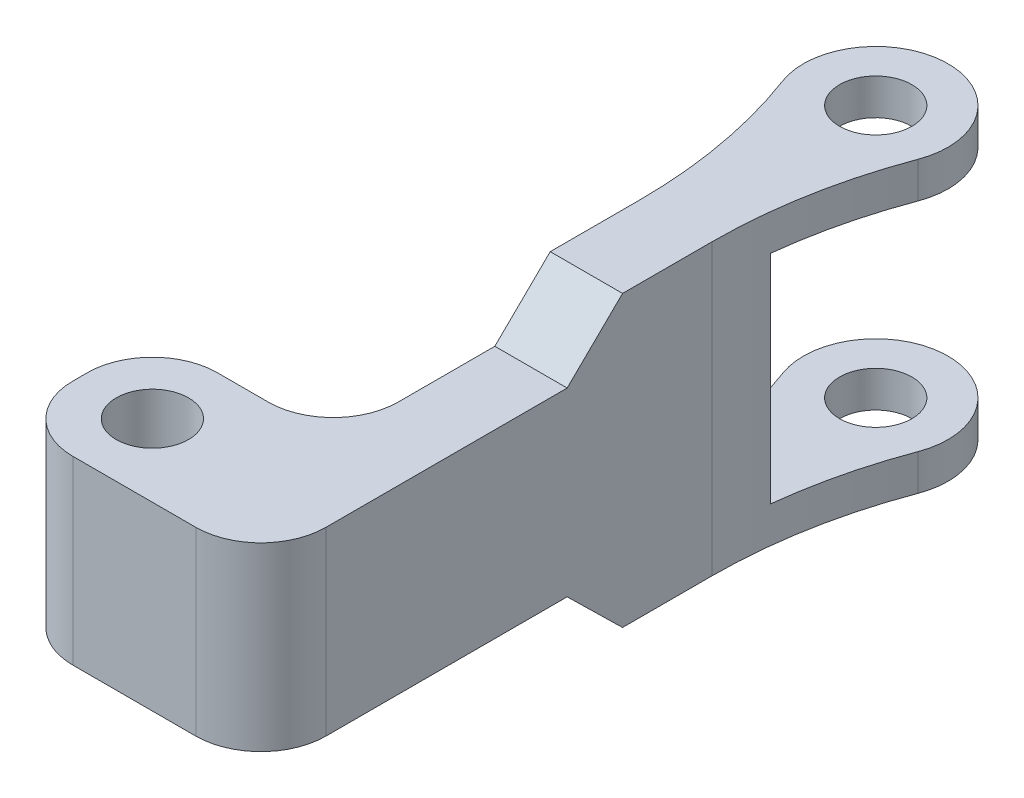
ISO-10303-21;
HEADER;
FILE_DESCRIPTION(('STEP AP214'),'2;1');
FILE_NAME('part.step','',(''),(''),'','','');
FILE_SCHEMA(('AUTOMOTIVE_DESIGN { 1 0 10303 214 1 1 1 1 }'));
ENDSEC;
DATA;
#1=APPLICATION_CONTEXT('core data for automotive mechanical design processes');
#2=APPLICATION_PROTOCOL_DEFINITION('international standard','automotive_design',2000,#1);
#3=PRODUCT_CONTEXT('',#1,'mechanical');
#4=PRODUCT('Part','Part','',(#3));
#5=PRODUCT_RELATED_PRODUCT_CATEGORY('part','',(#4));
#6=PRODUCT_DEFINITION_FORMATION('','',#4);
#7=PRODUCT_DEFINITION_CONTEXT('part definition',#1,'design');
#8=PRODUCT_DEFINITION('design','',#6,#7);
#9=PRODUCT_DEFINITION_SHAPE('','',#8);
#10=(LENGTH_UNIT() NAMED_UNIT(*) SI_UNIT(.MILLI.,.METRE.));
#11=(NAMED_UNIT(*) PLANE_ANGLE_UNIT() SI_UNIT($,.RADIAN.));
#12=(NAMED_UNIT(*) SI_UNIT($,.STERADIAN.) SOLID_ANGLE_UNIT());
#13=UNCERTAINTY_MEASURE_WITH_UNIT(LENGTH_MEASURE(1.E-05),#10,'distance_accuracy_value','');
#14=(GEOMETRIC_REPRESENTATION_CONTEXT(3) GLOBAL_UNCERTAINTY_ASSIGNED_CONTEXT((#13)) GLOBAL_UNIT_ASSIGNED_CONTEXT((#10,
#11,#12)) REPRESENTATION_CONTEXT('',''));
#15=CARTESIAN_POINT('',(0.,0.,0.));
#16=DIRECTION('',(0.,0.,1.));
#17=DIRECTION('',(1.,0.,0.));
#18=AXIS2_PLACEMENT_3D('',#15,#16,#17);
#19=CARTESIAN_POINT('',(10.,25.,-40.));
#20=DIRECTION('',(0.,-1.,0.));
#21=DIRECTION('',(0.,0.,-1.));
#22=AXIS2_PLACEMENT_3D('',#19,#20,#21);
#23=CYLINDRICAL_SURFACE('',#22,2.50000000000001);
#24=CARTESIAN_POINT('',(10.,5.,-40.));
#25=DIRECTION('',(0.,1.,0.));
#26=DIRECTION('',(0.,0.,1.));
#27=AXIS2_PLACEMENT_3D('',#24,#25,#26);
#28=CIRCLE('',#27,2.50000000000001);
#29=CARTESIAN_POINT('',(10.,5.,-37.5));
#30=VERTEX_POINT('',#29);
#31=EDGE_CURVE('E306',#30,#30,#28,.T.);
#32=ORIENTED_EDGE('',*,*,#31,.T.);
#33=EDGE_LOOP('',(#32));
#34=FACE_BOUND('',#33,.T.);
#35=CARTESIAN_POINT('',(10.,2.5,-40.));
#36=DIRECTION('',(0.,-1.,0.));
#37=DIRECTION('',(0.,0.,-1.));
#38=AXIS2_PLACEMENT_3D('',#35,#36,#37);
#39=CIRCLE('',#38,2.50000000000001);
#40=CARTESIAN_POINT('',(10.,2.49999999999999,-42.5));
#41=VERTEX_POINT('',#40);
#42=EDGE_CURVE('E215',#41,#41,#39,.T.);
#43=ORIENTED_EDGE('',*,*,#42,.T.);
#44=EDGE_LOOP('',(#43));
#45=FACE_BOUND('',#44,.T.);
#46=ADVANCED_FACE('F40',(#34,#45),#23,.F.);
#47=CARTESIAN_POINT('',(15.,5.,-30.0010376150604));
#48=DIRECTION('',(0.,0.,-1.));
#49=DIRECTION('',(0.,1.,0.));
#50=AXIS2_PLACEMENT_3D('',#47,#48,#49);
#51=PLANE('',#50);
#52=DIRECTION('',(0.,-1.,0.));
#53=VECTOR('',#52,1.);
#54=CARTESIAN_POINT('',(12.7132914100987,25.,-30.0010376150604));
#55=LINE('',#54,#53);
#56=CARTESIAN_POINT('',(12.7132914100987,20.,-30.0010376150604));
#57=VERTEX_POINT('',#56);
#58=CARTESIAN_POINT('',(12.7132914100987,5.,-30.0010376150604));
#59=VERTEX_POINT('',#58);
#60=EDGE_CURVE('E177',#57,#59,#55,.T.);
#61=ORIENTED_EDGE('',*,*,#60,.T.);
#62=DIRECTION('',(-1.,0.,0.));
#63=VECTOR('',#62,1.);
#64=CARTESIAN_POINT('',(15.,5.,-30.0010376150604));
#65=LINE('',#64,#63);
#66=CARTESIAN_POINT('',(7.28670858990132,5.,-30.0010376150604));
#67=VERTEX_POINT('',#66);
#68=EDGE_CURVE('E180',#59,#67,#65,.T.);
#69=ORIENTED_EDGE('',*,*,#68,.T.);
#70=DIRECTION('',(0.,-1.,0.));
#71=VECTOR('',#70,1.);
#72=CARTESIAN_POINT('',(7.28670858990132,25.,-30.0010376150604));
#73=LINE('',#72,#71);
#74=CARTESIAN_POINT('',(7.28670858990132,20.,-30.0010376150604));
#75=VERTEX_POINT('',#74);
#76=EDGE_CURVE('E11',#67,#75,#73,.F.);
#77=ORIENTED_EDGE('',*,*,#76,.T.);
#78=DIRECTION('',(-1.,0.,0.));
#79=VECTOR('',#78,1.);
#80=CARTESIAN_POINT('',(15.,20.,-30.0010376150604));
#81=LINE('',#80,#79);
#82=EDGE_CURVE('E183',#57,#75,#81,.T.);
#83=ORIENTED_EDGE('',*,*,#82,.F.);
#84=EDGE_LOOP('',(#61,#69,#77,#83));
#85=FACE_BOUND('',#84,.T.);
#86=ADVANCED_FACE('F179',(#85),#51,.T.);
#87=CARTESIAN_POINT('',(15.,20.,-30.0010376150604));
#88=DIRECTION('',(0.,-1.,0.));
#89=DIRECTION('',(0.,0.,-1.));
#90=AXIS2_PLACEMENT_3D('',#87,#88,#89);
#91=PLANE('',#90);
#92=CARTESIAN_POINT('',(10.,20.,-40.));
#93=DIRECTION('',(0.,-1.,0.));
#94=DIRECTION('',(0.,0.,-1.));
#95=AXIS2_PLACEMENT_3D('',#92,#93,#94);
#96=CIRCLE('',#95,2.50000000000001);
#97=CARTESIAN_POINT('',(10.,20.,-42.5));
#98=VERTEX_POINT('',#97);
#99=EDGE_CURVE('E201',#98,#98,#96,.T.);
#100=ORIENTED_EDGE('',*,*,#99,.F.);
#101=EDGE_LOOP('',(#100));
#102=FACE_BOUND('',#101,.T.);
#103=CARTESIAN_POINT('',(47.,20.,-26.1706833140606));
#104=DIRECTION('',(0.,-1.,0.));
#105=DIRECTION('',(0.,0.,-1.));
#106=AXIS2_PLACEMENT_3D('',#103,#104,#105);
#107=CIRCLE('',#106,34.5);
#108=CARTESIAN_POINT('',(14.6835443037975,20.,-38.2494535840583));
#109=VERTEX_POINT('',#108);
#110=EDGE_CURVE('E213',#109,#57,#107,.F.);
#111=ORIENTED_EDGE('',*,*,#110,.T.);
#112=ORIENTED_EDGE('',*,*,#82,.T.);
#113=CARTESIAN_POINT('',(-27.,20.,-26.1706833140606));
#114=DIRECTION('',(0.,-1.,0.));
#115=DIRECTION('',(0.,0.,-1.));
#116=AXIS2_PLACEMENT_3D('',#113,#114,#115);
#117=CIRCLE('',#116,34.5);
#118=CARTESIAN_POINT('',(5.31645569620252,20.,-38.2494535840583));
#119=VERTEX_POINT('',#118);
#120=EDGE_CURVE('E204',#75,#119,#117,.F.);
#121=ORIENTED_EDGE('',*,*,#120,.T.);
#122=CARTESIAN_POINT('',(10.,20.,-40.));
#123=DIRECTION('',(0.,-1.,0.));
#124=DIRECTION('',(0.,0.,-1.));
#125=AXIS2_PLACEMENT_3D('',#122,#123,#124);
#126=CIRCLE('',#125,5.00000000000001);
#127=EDGE_CURVE('E211',#119,#109,#126,.T.);
#128=ORIENTED_EDGE('',*,*,#127,.T.);
#129=EDGE_LOOP('',(#111,#112,#121,#128));
#130=FACE_BOUND('',#129,.T.);
#131=ADVANCED_FACE('F367',(#102,#130),#91,.T.);
#132=CARTESIAN_POINT('',(15.,5.00000000000001,-45.0010376150604));
#133=DIRECTION('',(0.,1.,0.));
#134=DIRECTION('',(0.,0.,1.));
#135=AXIS2_PLACEMENT_3D('',#132,#133,#134);
#136=PLANE('',#135);
#137=ORIENTED_EDGE('',*,*,#31,.F.);
#138=EDGE_LOOP('',(#137));
#139=FACE_BOUND('',#138,.T.);
#140=CARTESIAN_POINT('',(47.,5.,-26.1706833140606));
#141=DIRECTION('',(0.,1.,0.));
#142=DIRECTION('',(0.,0.,1.));
#143=AXIS2_PLACEMENT_3D('',#140,#141,#142);
#144=CIRCLE('',#143,34.5);
#145=CARTESIAN_POINT('',(14.6835443037975,5.,-38.2494535840583));
#146=VERTEX_POINT('',#145);
#147=EDGE_CURVE('E191',#59,#146,#144,.F.);
#148=ORIENTED_EDGE('',*,*,#147,.T.);
#149=CARTESIAN_POINT('',(10.,5.,-40.));
#150=DIRECTION('',(0.,1.,0.));
#151=DIRECTION('',(0.,0.,1.));
#152=AXIS2_PLACEMENT_3D('',#149,#150,#151);
#153=CIRCLE('',#152,5.00000000000001);
#154=CARTESIAN_POINT('',(5.31645569620252,5.,-38.2494535840583));
#155=VERTEX_POINT('',#154);
#156=EDGE_CURVE('E55',#146,#155,#153,.T.);
#157=ORIENTED_EDGE('',*,*,#156,.T.);
#158=CARTESIAN_POINT('',(-27.,5.,-26.1706833140606));
#159=DIRECTION('',(0.,1.,0.));
#160=DIRECTION('',(0.,0.,1.));
#161=AXIS2_PLACEMENT_3D('',#158,#159,#160);
#162=CIRCLE('',#161,34.5);
#163=EDGE_CURVE('E192',#155,#67,#162,.F.);
#164=ORIENTED_EDGE('',*,*,#163,.T.);
#165=ORIENTED_EDGE('',*,*,#68,.F.);
#166=EDGE_LOOP('',(#148,#157,#164,#165));
#167=FACE_BOUND('',#166,.T.);
#168=ADVANCED_FACE('F190',(#139,#167),#136,.T.);
#169=ORIENTED_EDGE('',*,*,#99,.T.);
#170=EDGE_LOOP('',(#169));
#171=FACE_BOUND('',#170,.T.);
#172=CARTESIAN_POINT('',(10.,22.5,-40.));
#173=DIRECTION('',(0.,1.,0.));
#174=DIRECTION('',(0.,0.,1.));
#175=AXIS2_PLACEMENT_3D('',#172,#173,#174);
#176=CIRCLE('',#175,2.50000000000001);
#177=CARTESIAN_POINT('',(10.,22.5,-37.5));
#178=VERTEX_POINT('',#177);
#179=EDGE_CURVE('E227',#178,#178,#176,.T.);
#180=ORIENTED_EDGE('',*,*,#179,.T.);
#181=EDGE_LOOP('',(#180));
#182=FACE_BOUND('',#181,.T.);
#183=ADVANCED_FACE('F410',(#171,#182),#23,.F.);
#184=CARTESIAN_POINT('',(15.,6.25,-16.1706833140606));
#185=DIRECTION('',(0.,-0.714467452155446,0.699668678597596));
#186=DIRECTION('',(0.,-0.699668678597596,-0.714467452155446));
#187=AXIS2_PLACEMENT_3D('',#184,#185,#186);
#188=PLANE('',#187);
#189=DIRECTION('',(0.,0.699668678597596,0.714467452155446));
#190=VECTOR('',#189,1.);
#191=CARTESIAN_POINT('',(12.5,16.0140183364893,-6.20014509066422));
#192=LINE('',#191,#190);
#193=CARTESIAN_POINT('',(12.5,2.5,-20.));
#194=VERTEX_POINT('',#193);
#195=CARTESIAN_POINT('',(12.5,6.25,-16.1706833140606));
#196=VERTEX_POINT('',#195);
#197=EDGE_CURVE('E267',#194,#196,#192,.T.);
#198=ORIENTED_EDGE('',*,*,#197,.T.);
#199=DIRECTION('',(-1.,0.,0.));
#200=VECTOR('',#199,1.);
#201=CARTESIAN_POINT('',(15.,6.25,-16.1706833140606));
#202=LINE('',#201,#200);
#203=CARTESIAN_POINT('',(7.5,6.25,-16.1706833140606));
#204=VERTEX_POINT('',#203);
#205=EDGE_CURVE('E361',#196,#204,#202,.T.);
#206=ORIENTED_EDGE('',*,*,#205,.T.);
#207=DIRECTION('',(0.,-0.699668678597596,-0.714467452155446));
#208=VECTOR('',#207,1.);
#209=CARTESIAN_POINT('',(7.5,18.7634160763176,-3.392594519622));
#210=LINE('',#209,#208);
#211=CARTESIAN_POINT('',(7.5,2.5,-20.));
#212=VERTEX_POINT('',#211);
#213=EDGE_CURVE('E305',#204,#212,#210,.T.);
#214=ORIENTED_EDGE('',*,*,#213,.T.);
#215=DIRECTION('',(-1.,0.,0.));
#216=VECTOR('',#215,1.);
#217=CARTESIAN_POINT('',(15.,2.5,-20.));
#218=LINE('',#217,#216);
#219=EDGE_CURVE('E358',#194,#212,#218,.T.);
#220=ORIENTED_EDGE('',*,*,#219,.F.);
#221=EDGE_LOOP('',(#198,#206,#214,#220));
#222=FACE_BOUND('',#221,.T.);
#223=ADVANCED_FACE('F392',(#222),#188,.T.);
#224=CARTESIAN_POINT('',(15.,6.25,5.));
#225=DIRECTION('',(0.,-1.,0.));
#226=DIRECTION('',(0.,0.,-1.));
#227=AXIS2_PLACEMENT_3D('',#224,#225,#226);
#228=PLANE('',#227);
#229=CARTESIAN_POINT('',(0.,6.25,0.));
#230=DIRECTION('',(0.,-1.,0.));
#231=DIRECTION('',(0.,0.,-1.));
#232=AXIS2_PLACEMENT_3D('',#229,#230,#231);
#233=CIRCLE('',#232,2.5);
#234=CARTESIAN_POINT('',(0.,6.25,-2.5));
#235=VERTEX_POINT('',#234);
#236=EDGE_CURVE('E238',#235,#235,#233,.T.);
#237=ORIENTED_EDGE('',*,*,#236,.F.);
#238=EDGE_LOOP('',(#237));
#239=FACE_BOUND('',#238,.T.);
#240=CARTESIAN_POINT('',(-0.5,6.25,0.5));
#241=DIRECTION('',(0.,-1.,0.));
#242=DIRECTION('',(0.,0.,-1.));
#243=AXIS2_PLACEMENT_3D('',#240,#241,#242);
#244=CIRCLE('',#243,4.5);
#245=CARTESIAN_POINT('',(-0.499999999999967,6.25,5.));
#246=VERTEX_POINT('',#245);
#247=CARTESIAN_POINT('',(-5.,6.25,0.499999999999967));
#248=VERTEX_POINT('',#247);
#249=EDGE_CURVE('E251',#246,#248,#244,.T.);
#250=ORIENTED_EDGE('',*,*,#249,.T.);
#251=DIRECTION('',(0.,0.,1.));
#252=VECTOR('',#251,1.);
#253=CARTESIAN_POINT('',(-5.,6.25,5.));
#254=LINE('',#253,#252);
#255=CARTESIAN_POINT('',(-5.,6.25,-0.500000000000001));
#256=VERTEX_POINT('',#255);
#257=EDGE_CURVE('E193',#256,#248,#254,.T.);
#258=ORIENTED_EDGE('',*,*,#257,.F.);
#259=CARTESIAN_POINT('',(-0.499999999999936,6.25,-0.5));
#260=DIRECTION('',(0.,-1.,0.));
#261=DIRECTION('',(0.,0.,-1.));
#262=AXIS2_PLACEMENT_3D('',#259,#260,#261);
#263=CIRCLE('',#262,4.5);
#264=CARTESIAN_POINT('',(-0.499999999999936,6.25,-5.));
#265=VERTEX_POINT('',#264);
#266=EDGE_CURVE('E239',#256,#265,#263,.T.);
#267=ORIENTED_EDGE('',*,*,#266,.T.);
#268=DIRECTION('',(1.,0.,0.));
#269=VECTOR('',#268,1.);
#270=CARTESIAN_POINT('',(-0.499999999999936,6.25,-5.));
#271=LINE('',#270,#269);
#272=CARTESIAN_POINT('',(3.,6.25,-5.));
#273=VERTEX_POINT('',#272);
#274=EDGE_CURVE('E241',#265,#273,#271,.T.);
#275=ORIENTED_EDGE('',*,*,#274,.T.);
#276=CARTESIAN_POINT('',(3.,6.25,-9.5));
#277=DIRECTION('',(0.,-1.,0.));
#278=DIRECTION('',(0.,0.,-1.));
#279=AXIS2_PLACEMENT_3D('',#276,#277,#278);
#280=CIRCLE('',#279,4.5);
#281=CARTESIAN_POINT('',(7.5,6.25,-9.5));
#282=VERTEX_POINT('',#281);
#283=EDGE_CURVE('E243',#273,#282,#280,.F.);
#284=ORIENTED_EDGE('',*,*,#283,.T.);
#285=DIRECTION('',(0.,0.,-1.));
#286=VECTOR('',#285,1.);
#287=CARTESIAN_POINT('',(7.5,6.25,-9.5));
#288=LINE('',#287,#286);
#289=EDGE_CURVE('E245',#282,#204,#288,.T.);
#290=ORIENTED_EDGE('',*,*,#289,.T.);
#291=ORIENTED_EDGE('',*,*,#205,.F.);
#292=DIRECTION('',(0.,0.,1.));
#293=VECTOR('',#292,1.);
#294=CARTESIAN_POINT('',(12.5,6.25,-15.));
#295=LINE('',#294,#293);
#296=CARTESIAN_POINT('',(12.5,6.25,0.499999999999967));
#297=VERTEX_POINT('',#296);
#298=EDGE_CURVE('E247',#196,#297,#295,.T.);
#299=ORIENTED_EDGE('',*,*,#298,.T.);
#300=CARTESIAN_POINT('',(8.,6.25,0.5));
#301=DIRECTION('',(0.,-1.,0.));
#302=DIRECTION('',(0.,0.,-1.));
#303=AXIS2_PLACEMENT_3D('',#300,#301,#302);
#304=CIRCLE('',#303,4.5);
#305=CARTESIAN_POINT('',(8.,6.25,5.));
#306=VERTEX_POINT('',#305);
#307=EDGE_CURVE('E249',#297,#306,#304,.T.);
#308=ORIENTED_EDGE('',*,*,#307,.T.);
#309=DIRECTION('',(-1.,0.,0.));
#310=VECTOR('',#309,1.);
#311=CARTESIAN_POINT('',(15.,6.25,5.));
#312=LINE('',#311,#310);
#313=EDGE_CURVE('E677',#306,#246,#312,.T.);
#314=ORIENTED_EDGE('',*,*,#313,.T.);
#315=EDGE_LOOP('',(#250,#258,#267,#275,#284,#290,#291,#299,#308,#314));
#316=FACE_BOUND('',#315,.T.);
#317=ADVANCED_FACE('F424',(#239,#316),#228,.T.);
#318=CARTESIAN_POINT('',(15.,2.5,-45.));
#319=DIRECTION('',(0.,-1.,0.));
#320=DIRECTION('',(0.,0.,-1.));
#321=AXIS2_PLACEMENT_3D('',#318,#319,#320);
#322=PLANE('',#321);
#323=ORIENTED_EDGE('',*,*,#42,.F.);
#324=EDGE_LOOP('',(#323));
#325=FACE_BOUND('',#324,.T.);
#326=DIRECTION('',(0.,0.,1.));
#327=VECTOR('',#326,1.);
#328=CARTESIAN_POINT('',(12.5,2.5,-15.));
#329=LINE('',#328,#327);
#330=CARTESIAN_POINT('',(12.5,2.5,-26.1706833140606));
#331=VERTEX_POINT('',#330);
#332=EDGE_CURVE('E225',#331,#194,#329,.T.);
#333=ORIENTED_EDGE('',*,*,#332,.T.);
#334=ORIENTED_EDGE('',*,*,#219,.T.);
#335=DIRECTION('',(0.,0.,-1.));
#336=VECTOR('',#335,1.);
#337=CARTESIAN_POINT('',(7.5,2.5,-9.5));
#338=LINE('',#337,#336);
#339=CARTESIAN_POINT('',(7.5,2.5,-26.1706833140606));
#340=VERTEX_POINT('',#339);
#341=EDGE_CURVE('E216',#212,#340,#338,.T.);
#342=ORIENTED_EDGE('',*,*,#341,.T.);
#343=CARTESIAN_POINT('',(-27.,2.5,-26.1706833140606));
#344=DIRECTION('',(0.,-1.,0.));
#345=DIRECTION('',(0.,0.,-1.));
#346=AXIS2_PLACEMENT_3D('',#343,#344,#345);
#347=CIRCLE('',#346,34.5);
#348=CARTESIAN_POINT('',(5.31645569620252,2.5,-38.2494535840583));
#349=VERTEX_POINT('',#348);
#350=EDGE_CURVE('E218',#340,#349,#347,.F.);
#351=ORIENTED_EDGE('',*,*,#350,.T.);
#352=CARTESIAN_POINT('',(10.,2.5,-40.));
#353=DIRECTION('',(0.,-1.,0.));
#354=DIRECTION('',(0.,0.,-1.));
#355=AXIS2_PLACEMENT_3D('',#352,#353,#354);
#356=CIRCLE('',#355,5.00000000000001);
#357=CARTESIAN_POINT('',(14.6835443037975,2.5,-38.2494535840583));
#358=VERTEX_POINT('',#357);
#359=EDGE_CURVE('E221',#349,#358,#356,.T.);
#360=ORIENTED_EDGE('',*,*,#359,.T.);
#361=CARTESIAN_POINT('',(47.,2.5,-26.1706833140606));
#362=DIRECTION('',(0.,-1.,0.));
#363=DIRECTION('',(0.,0.,-1.));
#364=AXIS2_PLACEMENT_3D('',#361,#362,#363);
#365=CIRCLE('',#364,34.5);
#366=EDGE_CURVE('E223',#358,#331,#365,.F.);
#367=ORIENTED_EDGE('',*,*,#366,.T.);
#368=EDGE_LOOP('',(#333,#334,#342,#351,#360,#367));
#369=FACE_BOUND('',#368,.T.);
#370=ADVANCED_FACE('F389',(#325,#369),#322,.T.);
#371=CARTESIAN_POINT('',(15.,18.75,-16.1706833140606));
#372=DIRECTION('',(0.,0.714467452155445,0.699668678597596));
#373=DIRECTION('',(0.,-0.699668678597596,0.714467452155445));
#374=AXIS2_PLACEMENT_3D('',#371,#372,#373);
#375=PLANE('',#374);
#376=DIRECTION('',(0.,0.699668678597596,-0.714467452155445));
#377=VECTOR('',#376,1.);
#378=CARTESIAN_POINT('',(12.5,21.2243881587733,-18.697407544429));
#379=LINE('',#378,#377);
#380=CARTESIAN_POINT('',(12.5,18.75,-16.1706833140606));
#381=VERTEX_POINT('',#380);
#382=CARTESIAN_POINT('',(12.5,22.5,-20.));
#383=VERTEX_POINT('',#382);
#384=EDGE_CURVE('E188',#381,#383,#379,.T.);
#385=ORIENTED_EDGE('',*,*,#384,.T.);
#386=DIRECTION('',(-1.,0.,0.));
#387=VECTOR('',#386,1.);
#388=CARTESIAN_POINT('',(15.,22.5,-20.));
#389=LINE('',#388,#387);
#390=CARTESIAN_POINT('',(7.5,22.5,-20.));
#391=VERTEX_POINT('',#390);
#392=EDGE_CURVE('E326',#383,#391,#389,.T.);
#393=ORIENTED_EDGE('',*,*,#392,.T.);
#394=DIRECTION('',(0.,-0.699668678597596,0.714467452155445));
#395=VECTOR('',#394,1.);
#396=CARTESIAN_POINT('',(7.5,18.4749904189451,-15.8898569733868));
#397=LINE('',#396,#395);
#398=CARTESIAN_POINT('',(7.5,18.75,-16.1706833140606));
#399=VERTEX_POINT('',#398);
#400=EDGE_CURVE('E48',#391,#399,#397,.T.);
#401=ORIENTED_EDGE('',*,*,#400,.T.);
#402=DIRECTION('',(-1.,0.,0.));
#403=VECTOR('',#402,1.);
#404=CARTESIAN_POINT('',(15.,18.75,-16.1706833140606));
#405=LINE('',#404,#403);
#406=EDGE_CURVE('E323',#381,#399,#405,.T.);
#407=ORIENTED_EDGE('',*,*,#406,.F.);
#408=EDGE_LOOP('',(#385,#393,#401,#407));
#409=FACE_BOUND('',#408,.T.);
#410=ADVANCED_FACE('F322',(#409),#375,.T.);
#411=CARTESIAN_POINT('',(15.,18.75,5.));
#412=DIRECTION('',(0.,1.,0.));
#413=DIRECTION('',(0.,0.,1.));
#414=AXIS2_PLACEMENT_3D('',#411,#412,#413);
#415=PLANE('',#414);
#416=CARTESIAN_POINT('',(0.,18.75,0.));
#417=DIRECTION('',(0.,1.,0.));
#418=DIRECTION('',(0.,0.,1.));
#419=AXIS2_PLACEMENT_3D('',#416,#417,#418);
#420=CIRCLE('',#419,2.5);
#421=CARTESIAN_POINT('',(0.,18.75,2.5));
#422=VERTEX_POINT('',#421);
#423=EDGE_CURVE('E253',#422,#422,#420,.T.);
#424=ORIENTED_EDGE('',*,*,#423,.F.);
#425=EDGE_LOOP('',(#424));
#426=FACE_BOUND('',#425,.T.);
#427=CARTESIAN_POINT('',(-0.5,18.75,0.5));
#428=DIRECTION('',(0.,1.,0.));
#429=DIRECTION('',(0.,0.,1.));
#430=AXIS2_PLACEMENT_3D('',#427,#428,#429);
#431=CIRCLE('',#430,4.5);
#432=CARTESIAN_POINT('',(-5.,18.75,0.499999999999967));
#433=VERTEX_POINT('',#432);
#434=CARTESIAN_POINT('',(-0.499999999999967,18.75,5.));
#435=VERTEX_POINT('',#434);
#436=EDGE_CURVE('E265',#433,#435,#431,.T.);
#437=ORIENTED_EDGE('',*,*,#436,.T.);
#438=DIRECTION('',(-1.,0.,0.));
#439=VECTOR('',#438,1.);
#440=CARTESIAN_POINT('',(15.,18.75,5.));
#441=LINE('',#440,#439);
#442=CARTESIAN_POINT('',(8.,18.75,5.));
#443=VERTEX_POINT('',#442);
#444=EDGE_CURVE('E333',#443,#435,#441,.T.);
#445=ORIENTED_EDGE('',*,*,#444,.F.);
#446=CARTESIAN_POINT('',(8.,18.75,0.5));
#447=DIRECTION('',(0.,1.,0.));
#448=DIRECTION('',(0.,0.,1.));
#449=AXIS2_PLACEMENT_3D('',#446,#447,#448);
#450=CIRCLE('',#449,4.5);
#451=CARTESIAN_POINT('',(12.5,18.75,0.499999999999967));
#452=VERTEX_POINT('',#451);
#453=EDGE_CURVE('E263',#443,#452,#450,.T.);
#454=ORIENTED_EDGE('',*,*,#453,.T.);
#455=DIRECTION('',(0.,0.,-1.));
#456=VECTOR('',#455,1.);
#457=CARTESIAN_POINT('',(12.5,18.75,-15.));
#458=LINE('',#457,#456);
#459=EDGE_CURVE('E261',#452,#381,#458,.T.);
#460=ORIENTED_EDGE('',*,*,#459,.T.);
#461=ORIENTED_EDGE('',*,*,#406,.T.);
#462=DIRECTION('',(0.,0.,1.));
#463=VECTOR('',#462,1.);
#464=CARTESIAN_POINT('',(7.5,18.75,-9.5));
#465=LINE('',#464,#463);
#466=CARTESIAN_POINT('',(7.5,18.75,-9.5));
#467=VERTEX_POINT('',#466);
#468=EDGE_CURVE('E259',#399,#467,#465,.T.);
#469=ORIENTED_EDGE('',*,*,#468,.T.);
#470=CARTESIAN_POINT('',(3.,18.75,-9.5));
#471=DIRECTION('',(0.,1.,0.));
#472=DIRECTION('',(0.,0.,1.));
#473=AXIS2_PLACEMENT_3D('',#470,#471,#472);
#474=CIRCLE('',#473,4.5);
#475=CARTESIAN_POINT('',(3.,18.75,-5.));
#476=VERTEX_POINT('',#475);
#477=EDGE_CURVE('E257',#467,#476,#474,.F.);
#478=ORIENTED_EDGE('',*,*,#477,.T.);
#479=DIRECTION('',(-1.,0.,0.));
#480=VECTOR('',#479,1.);
#481=CARTESIAN_POINT('',(-0.499999999999936,18.75,-5.));
#482=LINE('',#481,#480);
#483=CARTESIAN_POINT('',(-0.499999999999936,18.75,-5.));
#484=VERTEX_POINT('',#483);
#485=EDGE_CURVE('E255',#476,#484,#482,.T.);
#486=ORIENTED_EDGE('',*,*,#485,.T.);
#487=CARTESIAN_POINT('',(-0.499999999999936,18.75,-0.5));
#488=DIRECTION('',(0.,1.,0.));
#489=DIRECTION('',(0.,0.,1.));
#490=AXIS2_PLACEMENT_3D('',#487,#488,#489);
#491=CIRCLE('',#490,4.5);
#492=CARTESIAN_POINT('',(-4.99999999999994,18.75,-0.500000000000001));
#493=VERTEX_POINT('',#492);
#494=EDGE_CURVE('E63',#484,#493,#491,.T.);
#495=ORIENTED_EDGE('',*,*,#494,.T.);
#496=DIRECTION('',(0.,0.,-1.));
#497=VECTOR('',#496,1.);
#498=CARTESIAN_POINT('',(-5.,18.75,5.));
#499=LINE('',#498,#497);
#500=EDGE_CURVE('E356',#433,#493,#499,.T.);
#501=ORIENTED_EDGE('',*,*,#500,.F.);
#502=EDGE_LOOP('',(#437,#445,#454,#460,#461,#469,#478,#486,#495,#501));
#503=FACE_BOUND('',#502,.T.);
#504=ADVANCED_FACE('F330',(#426,#503),#415,.T.);
#505=CARTESIAN_POINT('',(15.,22.5,-45.));
#506=DIRECTION('',(0.,1.,0.));
#507=DIRECTION('',(0.,0.,1.));
#508=AXIS2_PLACEMENT_3D('',#505,#506,#507);
#509=PLANE('',#508);
#510=ORIENTED_EDGE('',*,*,#179,.F.);
#511=EDGE_LOOP('',(#510));
#512=FACE_BOUND('',#511,.T.);
#513=DIRECTION('',(0.,0.,-1.));
#514=VECTOR('',#513,1.);
#515=CARTESIAN_POINT('',(12.5,22.5,-15.));
#516=LINE('',#515,#514);
#517=CARTESIAN_POINT('',(12.5,22.5,-26.1706833140606));
#518=VERTEX_POINT('',#517);
#519=EDGE_CURVE('E236',#383,#518,#516,.T.);
#520=ORIENTED_EDGE('',*,*,#519,.T.);
#521=CARTESIAN_POINT('',(47.,22.5,-26.1706833140606));
#522=DIRECTION('',(0.,1.,0.));
#523=DIRECTION('',(0.,0.,1.));
#524=AXIS2_PLACEMENT_3D('',#521,#522,#523);
#525=CIRCLE('',#524,34.5);
#526=CARTESIAN_POINT('',(14.6835443037975,22.5,-38.2494535840583));
#527=VERTEX_POINT('',#526);
#528=EDGE_CURVE('E234',#518,#527,#525,.F.);
#529=ORIENTED_EDGE('',*,*,#528,.T.);
#530=CARTESIAN_POINT('',(10.,22.5,-40.));
#531=DIRECTION('',(0.,1.,0.));
#532=DIRECTION('',(0.,0.,1.));
#533=AXIS2_PLACEMENT_3D('',#530,#531,#532);
#534=CIRCLE('',#533,5.00000000000001);
#535=CARTESIAN_POINT('',(5.31645569620252,22.5,-38.2494535840583));
#536=VERTEX_POINT('',#535);
#537=EDGE_CURVE('E232',#527,#536,#534,.T.);
#538=ORIENTED_EDGE('',*,*,#537,.T.);
#539=CARTESIAN_POINT('',(-27.,22.5,-26.1706833140606));
#540=DIRECTION('',(0.,1.,0.));
#541=DIRECTION('',(0.,0.,1.));
#542=AXIS2_PLACEMENT_3D('',#539,#540,#541);
#543=CIRCLE('',#542,34.5);
#544=CARTESIAN_POINT('',(7.5,22.5,-26.1706833140606));
#545=VERTEX_POINT('',#544);
#546=EDGE_CURVE('E230',#536,#545,#543,.F.);
#547=ORIENTED_EDGE('',*,*,#546,.T.);
#548=DIRECTION('',(0.,0.,1.));
#549=VECTOR('',#548,1.);
#550=CARTESIAN_POINT('',(7.5,22.5,-9.5));
#551=LINE('',#550,#549);
#552=EDGE_CURVE('E228',#545,#391,#551,.T.);
#553=ORIENTED_EDGE('',*,*,#552,.T.);
#554=ORIENTED_EDGE('',*,*,#392,.F.);
#555=EDGE_LOOP('',(#520,#529,#538,#547,#553,#554));
#556=FACE_BOUND('',#555,.T.);
#557=ADVANCED_FACE('F432',(#512,#556),#509,.T.);
#558=CARTESIAN_POINT('',(0.,25.,0.));
#559=DIRECTION('',(0.,-1.,0.));
#560=DIRECTION('',(0.,0.,-1.));
#561=AXIS2_PLACEMENT_3D('',#558,#559,#560);
#562=CYLINDRICAL_SURFACE('',#561,2.5);
#563=ORIENTED_EDGE('',*,*,#236,.T.);
#564=EDGE_LOOP('',(#563));
#565=FACE_BOUND('',#564,.T.);
#566=ORIENTED_EDGE('',*,*,#423,.T.);
#567=EDGE_LOOP('',(#566));
#568=FACE_BOUND('',#567,.T.);
#569=ADVANCED_FACE('F434',(#565,#568),#562,.F.);
#570=CARTESIAN_POINT('',(-0.5,25.,0.5));
#571=DIRECTION('',(0.,-1.,0.));
#572=DIRECTION('',(0.,0.,-1.));
#573=AXIS2_PLACEMENT_3D('',#570,#571,#572);
#574=CYLINDRICAL_SURFACE('',#573,4.5);
#575=ORIENTED_EDGE('',*,*,#436,.F.);
#576=DIRECTION('',(0.,-1.,0.));
#577=VECTOR('',#576,1.);
#578=CARTESIAN_POINT('',(-5.,25.,0.499999999999967));
#579=LINE('',#578,#577);
#580=EDGE_CURVE('E187',#433,#248,#579,.T.);
#581=ORIENTED_EDGE('',*,*,#580,.T.);
#582=ORIENTED_EDGE('',*,*,#249,.F.);
#583=DIRECTION('',(0.,-1.,0.));
#584=VECTOR('',#583,1.);
#585=CARTESIAN_POINT('',(-0.499999999999967,25.,5.));
#586=LINE('',#585,#584);
#587=EDGE_CURVE('E302',#435,#246,#586,.T.);
#588=ORIENTED_EDGE('',*,*,#587,.F.);
#589=EDGE_LOOP('',(#575,#581,#582,#588));
#590=FACE_BOUND('',#589,.T.);
#591=ADVANCED_FACE('F42',(#590),#574,.T.);
#592=CARTESIAN_POINT('',(-0.499999999999967,25.,5.));
#593=DIRECTION('',(0.,0.,-1.));
#594=DIRECTION('',(-1.,0.,0.));
#595=AXIS2_PLACEMENT_3D('',#592,#593,#594);
#596=PLANE('',#595);
#597=ORIENTED_EDGE('',*,*,#444,.T.);
#598=ORIENTED_EDGE('',*,*,#587,.T.);
#599=ORIENTED_EDGE('',*,*,#313,.F.);
#600=DIRECTION('',(0.,-1.,0.));
#601=VECTOR('',#600,1.);
#602=CARTESIAN_POINT('',(7.99999999999997,25.,5.));
#603=LINE('',#602,#601);
#604=EDGE_CURVE('E299',#443,#306,#603,.T.);
#605=ORIENTED_EDGE('',*,*,#604,.F.);
#606=EDGE_LOOP('',(#597,#598,#599,#605));
#607=FACE_BOUND('',#606,.T.);
#608=ADVANCED_FACE('F525',(#607),#596,.F.);
#609=CARTESIAN_POINT('',(8.,25.,0.5));
#610=DIRECTION('',(0.,-1.,0.));
#611=DIRECTION('',(0.,0.,-1.));
#612=AXIS2_PLACEMENT_3D('',#609,#610,#611);
#613=CYLINDRICAL_SURFACE('',#612,4.5);
#614=ORIENTED_EDGE('',*,*,#453,.F.);
#615=ORIENTED_EDGE('',*,*,#604,.T.);
#616=ORIENTED_EDGE('',*,*,#307,.F.);
#617=DIRECTION('',(0.,-1.,0.));
#618=VECTOR('',#617,1.);
#619=CARTESIAN_POINT('',(12.5,25.,0.499999999999967));
#620=LINE('',#619,#618);
#621=EDGE_CURVE('E296',#452,#297,#620,.T.);
#622=ORIENTED_EDGE('',*,*,#621,.F.);
#623=EDGE_LOOP('',(#614,#615,#616,#622));
#624=FACE_BOUND('',#623,.T.);
#625=ADVANCED_FACE('F536',(#624),#613,.T.);
#626=CARTESIAN_POINT('',(12.5,25.,-15.));
#627=DIRECTION('',(-1.,0.,0.));
#628=DIRECTION('',(0.,0.,1.));
#629=AXIS2_PLACEMENT_3D('',#626,#627,#628);
#630=PLANE('',#629);
#631=ORIENTED_EDGE('',*,*,#459,.F.);
#632=ORIENTED_EDGE('',*,*,#621,.T.);
#633=ORIENTED_EDGE('',*,*,#298,.F.);
#634=ORIENTED_EDGE('',*,*,#197,.F.);
#635=ORIENTED_EDGE('',*,*,#332,.F.);
#636=DIRECTION('',(0.,-1.,0.));
#637=VECTOR('',#636,1.);
#638=CARTESIAN_POINT('',(12.5,25.,-26.1706833140606));
#639=LINE('',#638,#637);
#640=EDGE_CURVE('E293',#518,#331,#639,.T.);
#641=ORIENTED_EDGE('',*,*,#640,.F.);
#642=ORIENTED_EDGE('',*,*,#519,.F.);
#643=ORIENTED_EDGE('',*,*,#384,.F.);
#644=EDGE_LOOP('',(#631,#632,#633,#634,#635,#641,#642,#643));
#645=FACE_BOUND('',#644,.T.);
#646=ADVANCED_FACE('F384',(#645),#630,.F.);
#647=CARTESIAN_POINT('',(47.,25.,-26.1706833140606));
#648=DIRECTION('',(0.,-1.,0.));
#649=DIRECTION('',(0.,0.,-1.));
#650=AXIS2_PLACEMENT_3D('',#647,#648,#649);
#651=CYLINDRICAL_SURFACE('',#650,34.5);
#652=ORIENTED_EDGE('',*,*,#528,.F.);
#653=ORIENTED_EDGE('',*,*,#640,.T.);
#654=ORIENTED_EDGE('',*,*,#366,.F.);
#655=DIRECTION('',(0.,-1.,0.));
#656=VECTOR('',#655,1.);
#657=CARTESIAN_POINT('',(14.6835443037975,25.,-38.2494535840583));
#658=LINE('',#657,#656);
#659=EDGE_CURVE('E200',#146,#358,#658,.T.);
#660=ORIENTED_EDGE('',*,*,#659,.F.);
#661=ORIENTED_EDGE('',*,*,#147,.F.);
#662=ORIENTED_EDGE('',*,*,#60,.F.);
#663=ORIENTED_EDGE('',*,*,#110,.F.);
#664=EDGE_CURVE('E292',#527,#109,#658,.T.);
#665=ORIENTED_EDGE('',*,*,#664,.F.);
#666=EDGE_LOOP('',(#652,#653,#654,#660,#661,#662,#663,#665));
#667=FACE_BOUND('',#666,.T.);
#668=ADVANCED_FACE('F197',(#667),#651,.F.);
#669=CARTESIAN_POINT('',(10.,25.,-40.));
#670=DIRECTION('',(0.,-1.,0.));
#671=DIRECTION('',(0.,0.,-1.));
#672=AXIS2_PLACEMENT_3D('',#669,#670,#671);
#673=CYLINDRICAL_SURFACE('',#672,5.00000000000001);
#674=DIRECTION('',(0.,-1.,0.));
#675=VECTOR('',#674,1.);
#676=CARTESIAN_POINT('',(5.31645569620252,25.,-38.2494535840583));
#677=LINE('',#676,#675);
#678=EDGE_CURVE('E290',#536,#119,#677,.T.);
#679=ORIENTED_EDGE('',*,*,#678,.F.);
#680=ORIENTED_EDGE('',*,*,#537,.F.);
#681=ORIENTED_EDGE('',*,*,#664,.T.);
#682=ORIENTED_EDGE('',*,*,#127,.F.);
#683=EDGE_LOOP('',(#679,#680,#681,#682));
#684=FACE_BOUND('',#683,.T.);
#685=ADVANCED_FACE('F376',(#684),#673,.T.);
#686=ORIENTED_EDGE('',*,*,#359,.F.);
#687=EDGE_CURVE('E287',#155,#349,#677,.T.);
#688=ORIENTED_EDGE('',*,*,#687,.F.);
#689=ORIENTED_EDGE('',*,*,#156,.F.);
#690=ORIENTED_EDGE('',*,*,#659,.T.);
#691=EDGE_LOOP('',(#686,#688,#689,#690));
#692=FACE_BOUND('',#691,.T.);
#693=ADVANCED_FACE('F398',(#692),#673,.T.);
#694=CARTESIAN_POINT('',(-27.,25.,-26.1706833140606));
#695=DIRECTION('',(0.,-1.,0.));
#696=DIRECTION('',(0.,0.,-1.));
#697=AXIS2_PLACEMENT_3D('',#694,#695,#696);
#698=CYLINDRICAL_SURFACE('',#697,34.5);
#699=ORIENTED_EDGE('',*,*,#546,.F.);
#700=ORIENTED_EDGE('',*,*,#678,.T.);
#701=ORIENTED_EDGE('',*,*,#120,.F.);
#702=ORIENTED_EDGE('',*,*,#76,.F.);
#703=ORIENTED_EDGE('',*,*,#163,.F.);
#704=ORIENTED_EDGE('',*,*,#687,.T.);
#705=ORIENTED_EDGE('',*,*,#350,.F.);
#706=DIRECTION('',(0.,-1.,0.));
#707=VECTOR('',#706,1.);
#708=CARTESIAN_POINT('',(7.5,25.,-26.1706833140606));
#709=LINE('',#708,#707);
#710=EDGE_CURVE('E284',#545,#340,#709,.T.);
#711=ORIENTED_EDGE('',*,*,#710,.F.);
#712=EDGE_LOOP('',(#699,#700,#701,#702,#703,#704,#705,#711));
#713=FACE_BOUND('',#712,.T.);
#714=ADVANCED_FACE('F371',(#713),#698,.F.);
#715=CARTESIAN_POINT('',(7.5,25.,-9.5));
#716=DIRECTION('',(1.,0.,0.));
#717=DIRECTION('',(0.,0.,-1.));
#718=AXIS2_PLACEMENT_3D('',#715,#716,#717);
#719=PLANE('',#718);
#720=ORIENTED_EDGE('',*,*,#468,.F.);
#721=ORIENTED_EDGE('',*,*,#400,.F.);
#722=ORIENTED_EDGE('',*,*,#552,.F.);
#723=ORIENTED_EDGE('',*,*,#710,.T.);
#724=ORIENTED_EDGE('',*,*,#341,.F.);
#725=ORIENTED_EDGE('',*,*,#213,.F.);
#726=ORIENTED_EDGE('',*,*,#289,.F.);
#727=DIRECTION('',(0.,-1.,0.));
#728=VECTOR('',#727,1.);
#729=CARTESIAN_POINT('',(7.5,25.,-9.5));
#730=LINE('',#729,#728);
#731=EDGE_CURVE('E281',#467,#282,#730,.T.);
#732=ORIENTED_EDGE('',*,*,#731,.F.);
#733=EDGE_LOOP('',(#720,#721,#722,#723,#724,#725,#726,#732));
#734=FACE_BOUND('',#733,.T.);
#735=ADVANCED_FACE('F336',(#734),#719,.F.);
#736=CARTESIAN_POINT('',(3.,25.,-9.5));
#737=DIRECTION('',(0.,-1.,0.));
#738=DIRECTION('',(0.,0.,-1.));
#739=AXIS2_PLACEMENT_3D('',#736,#737,#738);
#740=CYLINDRICAL_SURFACE('',#739,4.5);
#741=ORIENTED_EDGE('',*,*,#477,.F.);
#742=ORIENTED_EDGE('',*,*,#731,.T.);
#743=ORIENTED_EDGE('',*,*,#283,.F.);
#744=DIRECTION('',(0.,-1.,0.));
#745=VECTOR('',#744,1.);
#746=CARTESIAN_POINT('',(3.,25.,-5.));
#747=LINE('',#746,#745);
#748=EDGE_CURVE('E278',#476,#273,#747,.T.);
#749=ORIENTED_EDGE('',*,*,#748,.F.);
#750=EDGE_LOOP('',(#741,#742,#743,#749));
#751=FACE_BOUND('',#750,.T.);
#752=ADVANCED_FACE('F341',(#751),#740,.F.);
#753=CARTESIAN_POINT('',(-0.499999999999936,25.,-5.));
#754=DIRECTION('',(0.,0.,1.));
#755=DIRECTION('',(1.,0.,0.));
#756=AXIS2_PLACEMENT_3D('',#753,#754,#755);
#757=PLANE('',#756);
#758=ORIENTED_EDGE('',*,*,#485,.F.);
#759=ORIENTED_EDGE('',*,*,#748,.T.);
#760=ORIENTED_EDGE('',*,*,#274,.F.);
#761=DIRECTION('',(0.,-1.,0.));
#762=VECTOR('',#761,1.);
#763=CARTESIAN_POINT('',(-0.499999999999936,25.,-5.));
#764=LINE('',#763,#762);
#765=EDGE_CURVE('E275',#484,#265,#764,.T.);
#766=ORIENTED_EDGE('',*,*,#765,.F.);
#767=EDGE_LOOP('',(#758,#759,#760,#766));
#768=FACE_BOUND('',#767,.T.);
#769=ADVANCED_FACE('F346',(#768),#757,.F.);
#770=CARTESIAN_POINT('',(-0.499999999999936,25.,-0.5));
#771=DIRECTION('',(0.,-1.,0.));
#772=DIRECTION('',(0.,0.,-1.));
#773=AXIS2_PLACEMENT_3D('',#770,#771,#772);
#774=CYLINDRICAL_SURFACE('',#773,4.5);
#775=ORIENTED_EDGE('',*,*,#494,.F.);
#776=ORIENTED_EDGE('',*,*,#765,.T.);
#777=ORIENTED_EDGE('',*,*,#266,.F.);
#778=DIRECTION('',(0.,-1.,0.));
#779=VECTOR('',#778,1.);
#780=CARTESIAN_POINT('',(-4.99999999999994,25.,-0.500000000000001));
#781=LINE('',#780,#779);
#782=EDGE_CURVE('E272',#493,#256,#781,.T.);
#783=ORIENTED_EDGE('',*,*,#782,.F.);
#784=EDGE_LOOP('',(#775,#776,#777,#783));
#785=FACE_BOUND('',#784,.T.);
#786=ADVANCED_FACE('F350',(#785),#774,.T.);
#787=CARTESIAN_POINT('',(-5.,25.,0.499999999999967));
#788=DIRECTION('',(1.,0.,0.));
#789=DIRECTION('',(0.,0.,-1.));
#790=AXIS2_PLACEMENT_3D('',#787,#788,#789);
#791=PLANE('',#790);
#792=ORIENTED_EDGE('',*,*,#500,.T.);
#793=ORIENTED_EDGE('',*,*,#782,.T.);
#794=ORIENTED_EDGE('',*,*,#257,.T.);
#795=ORIENTED_EDGE('',*,*,#580,.F.);
#796=EDGE_LOOP('',(#792,#793,#794,#795));
#797=FACE_BOUND('',#796,.T.);
#798=ADVANCED_FACE('F354',(#797),#791,.F.);
#799=CLOSED_SHELL('',(#46,#86,#131,#168,#183,#223,#317,#370,#410,#504,#557,#569,#591,#608,#625,
#646,#668,#685,#693,#714,#735,#752,#769,#786,#798));
#800=MANIFOLD_SOLID_BREP('B2',#799);
#801=ADVANCED_BREP_SHAPE_REPRESENTATION('',(#18,#800),#14);
#802=SHAPE_DEFINITION_REPRESENTATION(#9,#801);
ENDSEC;
END-ISO-10303-21;
